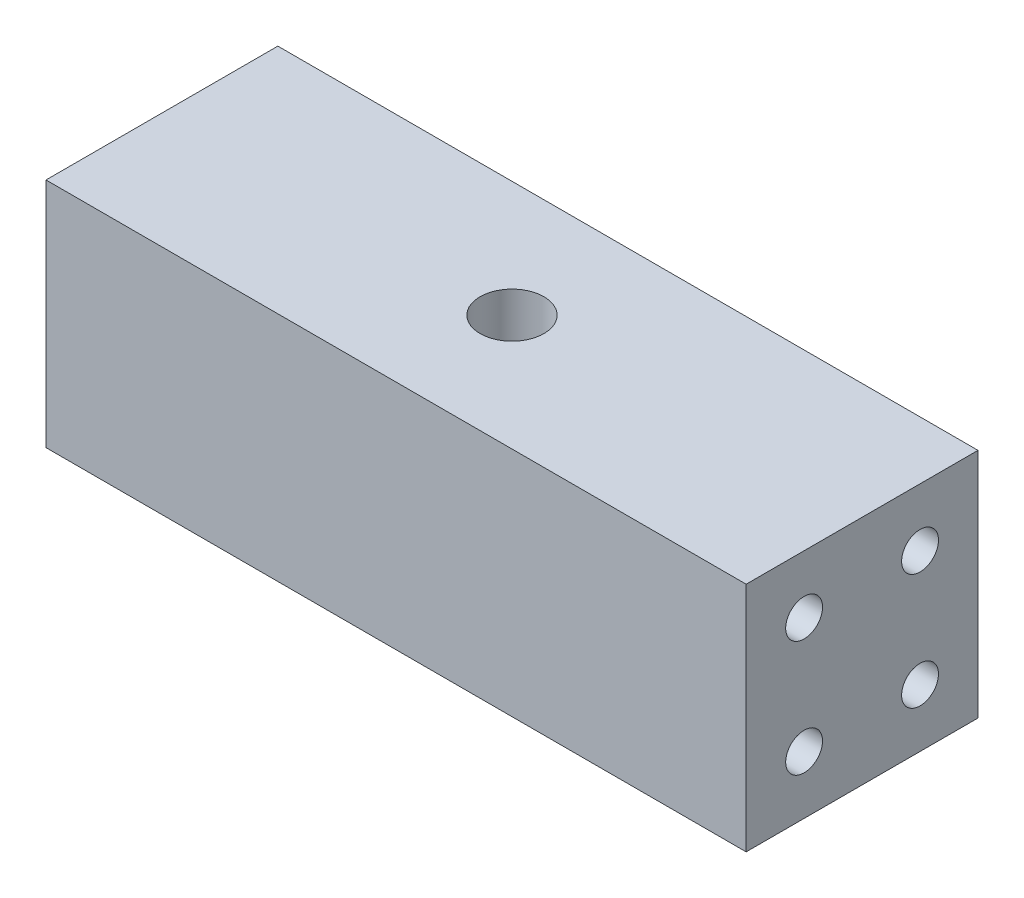
ISO-10303-21;
HEADER;
FILE_DESCRIPTION(('STEP AP214'),'2;1');
FILE_NAME('part.step','',(''),(''),'','','');
FILE_SCHEMA(('AUTOMOTIVE_DESIGN { 1 0 10303 214 1 1 1 1 }'));
ENDSEC;
DATA;
#1=APPLICATION_CONTEXT('core data for automotive mechanical design processes');
#2=APPLICATION_PROTOCOL_DEFINITION('international standard','automotive_design',2000,#1);
#3=PRODUCT_CONTEXT('',#1,'mechanical');
#4=PRODUCT('Part','Part','',(#3));
#5=PRODUCT_RELATED_PRODUCT_CATEGORY('part','',(#4));
#6=PRODUCT_DEFINITION_FORMATION('','',#4);
#7=PRODUCT_DEFINITION_CONTEXT('part definition',#1,'design');
#8=PRODUCT_DEFINITION('design','',#6,#7);
#9=PRODUCT_DEFINITION_SHAPE('','',#8);
#10=(LENGTH_UNIT() NAMED_UNIT(*) SI_UNIT(.MILLI.,.METRE.));
#11=(NAMED_UNIT(*) PLANE_ANGLE_UNIT() SI_UNIT($,.RADIAN.));
#12=(NAMED_UNIT(*) SI_UNIT($,.STERADIAN.) SOLID_ANGLE_UNIT());
#13=UNCERTAINTY_MEASURE_WITH_UNIT(LENGTH_MEASURE(1.E-05),#10,'distance_accuracy_value','');
#14=(GEOMETRIC_REPRESENTATION_CONTEXT(3) GLOBAL_UNCERTAINTY_ASSIGNED_CONTEXT((#13)) GLOBAL_UNIT_ASSIGNED_CONTEXT((#10,
#11,#12)) REPRESENTATION_CONTEXT('',''));
#15=CARTESIAN_POINT('',(0.,0.,0.));
#16=DIRECTION('',(0.,0.,1.));
#17=DIRECTION('',(1.,0.,0.));
#18=AXIS2_PLACEMENT_3D('',#15,#16,#17);
#19=CARTESIAN_POINT('',(0.,25.4,0.));
#20=DIRECTION('',(1.,0.,0.));
#21=DIRECTION('',(0.,0.,-1.));
#22=AXIS2_PLACEMENT_3D('',#19,#20,#21);
#23=PLANE('',#22);
#24=CARTESIAN_POINT('',(0.,19.05,-19.05));
#25=DIRECTION('',(-1.,0.,0.));
#26=DIRECTION('',(0.,0.,1.));
#27=AXIS2_PLACEMENT_3D('',#24,#25,#26);
#28=CIRCLE('',#27,2.0193);
#29=CARTESIAN_POINT('',(0.,19.05,-17.0307));
#30=VERTEX_POINT('',#29);
#31=EDGE_CURVE('E128',#30,#30,#28,.T.);
#32=ORIENTED_EDGE('',*,*,#31,.F.);
#33=EDGE_LOOP('',(#32));
#34=FACE_BOUND('',#33,.T.);
#35=CARTESIAN_POINT('',(0.,19.05,-6.35));
#36=DIRECTION('',(-1.,0.,0.));
#37=DIRECTION('',(0.,0.,1.));
#38=AXIS2_PLACEMENT_3D('',#35,#36,#37);
#39=CIRCLE('',#38,2.0193);
#40=CARTESIAN_POINT('',(0.,19.05,-4.3307));
#41=VERTEX_POINT('',#40);
#42=EDGE_CURVE('E127',#41,#41,#39,.T.);
#43=ORIENTED_EDGE('',*,*,#42,.F.);
#44=EDGE_LOOP('',(#43));
#45=FACE_BOUND('',#44,.T.);
#46=CARTESIAN_POINT('',(0.,6.35,-6.35));
#47=DIRECTION('',(-1.,0.,0.));
#48=DIRECTION('',(0.,0.,1.));
#49=AXIS2_PLACEMENT_3D('',#46,#47,#48);
#50=CIRCLE('',#49,2.0193);
#51=CARTESIAN_POINT('',(0.,6.35,-4.3307));
#52=VERTEX_POINT('',#51);
#53=EDGE_CURVE('E143',#52,#52,#50,.T.);
#54=ORIENTED_EDGE('',*,*,#53,.F.);
#55=EDGE_LOOP('',(#54));
#56=FACE_BOUND('',#55,.T.);
#57=CARTESIAN_POINT('',(0.,6.35,-19.05));
#58=DIRECTION('',(-1.,0.,0.));
#59=DIRECTION('',(0.,0.,1.));
#60=AXIS2_PLACEMENT_3D('',#57,#58,#59);
#61=CIRCLE('',#60,2.0193);
#62=CARTESIAN_POINT('',(0.,6.35,-17.0307));
#63=VERTEX_POINT('',#62);
#64=EDGE_CURVE('E151',#63,#63,#61,.T.);
#65=ORIENTED_EDGE('',*,*,#64,.F.);
#66=EDGE_LOOP('',(#65));
#67=FACE_BOUND('',#66,.T.);
#68=DIRECTION('',(0.,0.,1.));
#69=VECTOR('',#68,1.);
#70=CARTESIAN_POINT('',(0.,0.,0.));
#71=LINE('',#70,#69);
#72=CARTESIAN_POINT('',(0.,0.,-25.4));
#73=VERTEX_POINT('',#72);
#74=CARTESIAN_POINT('',(0.,0.,0.));
#75=VERTEX_POINT('',#74);
#76=EDGE_CURVE('E191',#73,#75,#71,.T.);
#77=ORIENTED_EDGE('',*,*,#76,.T.);
#78=DIRECTION('',(0.,-1.,0.));
#79=VECTOR('',#78,1.);
#80=CARTESIAN_POINT('',(0.,25.4,0.));
#81=LINE('',#80,#79);
#82=CARTESIAN_POINT('',(0.,25.4,0.));
#83=VERTEX_POINT('',#82);
#84=EDGE_CURVE('E11',#83,#75,#81,.T.);
#85=ORIENTED_EDGE('',*,*,#84,.F.);
#86=DIRECTION('',(0.,0.,1.));
#87=VECTOR('',#86,1.);
#88=CARTESIAN_POINT('',(0.,25.4,0.));
#89=LINE('',#88,#87);
#90=CARTESIAN_POINT('',(0.,25.4,-25.4));
#91=VERTEX_POINT('',#90);
#92=EDGE_CURVE('E192',#91,#83,#89,.T.);
#93=ORIENTED_EDGE('',*,*,#92,.F.);
#94=DIRECTION('',(0.,-1.,0.));
#95=VECTOR('',#94,1.);
#96=CARTESIAN_POINT('',(0.,25.4,-25.4));
#97=LINE('',#96,#95);
#98=EDGE_CURVE('E202',#91,#73,#97,.T.);
#99=ORIENTED_EDGE('',*,*,#98,.T.);
#100=EDGE_LOOP('',(#77,#85,#93,#99));
#101=FACE_BOUND('',#100,.T.);
#102=ADVANCED_FACE('F43',(#34,#45,#56,#67,#101),#23,.F.);
#103=CARTESIAN_POINT('',(0.,25.4,0.));
#104=DIRECTION('',(0.,0.,-1.));
#105=DIRECTION('',(-1.,0.,0.));
#106=AXIS2_PLACEMENT_3D('',#103,#104,#105);
#107=PLANE('',#106);
#108=DIRECTION('',(1.,0.,0.));
#109=VECTOR('',#108,1.);
#110=CARTESIAN_POINT('',(0.,0.,0.));
#111=LINE('',#110,#109);
#112=CARTESIAN_POINT('',(76.708,0.,0.));
#113=VERTEX_POINT('',#112);
#114=EDGE_CURVE('E206',#75,#113,#111,.T.);
#115=ORIENTED_EDGE('',*,*,#114,.T.);
#116=DIRECTION('',(0.,-1.,0.));
#117=VECTOR('',#116,1.);
#118=CARTESIAN_POINT('',(76.708,25.4,0.));
#119=LINE('',#118,#117);
#120=CARTESIAN_POINT('',(76.708,25.4,0.));
#121=VERTEX_POINT('',#120);
#122=EDGE_CURVE('E52',#121,#113,#119,.T.);
#123=ORIENTED_EDGE('',*,*,#122,.F.);
#124=DIRECTION('',(1.,0.,0.));
#125=VECTOR('',#124,1.);
#126=CARTESIAN_POINT('',(0.,25.4,0.));
#127=LINE('',#126,#125);
#128=EDGE_CURVE('E91',#83,#121,#127,.T.);
#129=ORIENTED_EDGE('',*,*,#128,.F.);
#130=ORIENTED_EDGE('',*,*,#84,.T.);
#131=EDGE_LOOP('',(#115,#123,#129,#130));
#132=FACE_BOUND('',#131,.T.);
#133=ADVANCED_FACE('F236',(#132),#107,.F.);
#134=CARTESIAN_POINT('',(76.708,25.4,0.));
#135=DIRECTION('',(-1.,0.,0.));
#136=DIRECTION('',(0.,0.,1.));
#137=AXIS2_PLACEMENT_3D('',#134,#135,#136);
#138=PLANE('',#137);
#139=CARTESIAN_POINT('',(76.708,19.05,-6.35));
#140=DIRECTION('',(1.,0.,0.));
#141=DIRECTION('',(0.,0.,-1.));
#142=AXIS2_PLACEMENT_3D('',#139,#140,#141);
#143=CIRCLE('',#142,2.0193);
#144=CARTESIAN_POINT('',(76.708,19.05,-8.3693));
#145=VERTEX_POINT('',#144);
#146=EDGE_CURVE('E159',#145,#145,#143,.T.);
#147=ORIENTED_EDGE('',*,*,#146,.F.);
#148=EDGE_LOOP('',(#147));
#149=FACE_BOUND('',#148,.T.);
#150=CARTESIAN_POINT('',(76.708,19.05,-19.05));
#151=DIRECTION('',(1.,0.,0.));
#152=DIRECTION('',(0.,0.,-1.));
#153=AXIS2_PLACEMENT_3D('',#150,#151,#152);
#154=CIRCLE('',#153,2.0193);
#155=CARTESIAN_POINT('',(76.708,19.05,-21.0693));
#156=VERTEX_POINT('',#155);
#157=EDGE_CURVE('E167',#156,#156,#154,.T.);
#158=ORIENTED_EDGE('',*,*,#157,.F.);
#159=EDGE_LOOP('',(#158));
#160=FACE_BOUND('',#159,.T.);
#161=CARTESIAN_POINT('',(76.708,6.35,-19.05));
#162=DIRECTION('',(1.,0.,0.));
#163=DIRECTION('',(0.,0.,-1.));
#164=AXIS2_PLACEMENT_3D('',#161,#162,#163);
#165=CIRCLE('',#164,2.0193);
#166=CARTESIAN_POINT('',(76.708,6.35,-21.0693));
#167=VERTEX_POINT('',#166);
#168=EDGE_CURVE('E175',#167,#167,#165,.T.);
#169=ORIENTED_EDGE('',*,*,#168,.F.);
#170=EDGE_LOOP('',(#169));
#171=FACE_BOUND('',#170,.T.);
#172=CARTESIAN_POINT('',(76.708,6.35,-6.35));
#173=DIRECTION('',(1.,0.,0.));
#174=DIRECTION('',(0.,0.,-1.));
#175=AXIS2_PLACEMENT_3D('',#172,#173,#174);
#176=CIRCLE('',#175,2.0193);
#177=CARTESIAN_POINT('',(76.708,6.35,-8.3693));
#178=VERTEX_POINT('',#177);
#179=EDGE_CURVE('E183',#178,#178,#176,.T.);
#180=ORIENTED_EDGE('',*,*,#179,.F.);
#181=EDGE_LOOP('',(#180));
#182=FACE_BOUND('',#181,.T.);
#183=DIRECTION('',(0.,0.,-1.));
#184=VECTOR('',#183,1.);
#185=CARTESIAN_POINT('',(76.708,0.,0.));
#186=LINE('',#185,#184);
#187=CARTESIAN_POINT('',(76.708,0.,-25.4));
#188=VERTEX_POINT('',#187);
#189=EDGE_CURVE('E78',#113,#188,#186,.T.);
#190=ORIENTED_EDGE('',*,*,#189,.T.);
#191=DIRECTION('',(0.,-1.,0.));
#192=VECTOR('',#191,1.);
#193=CARTESIAN_POINT('',(76.708,25.4,-25.4));
#194=LINE('',#193,#192);
#195=CARTESIAN_POINT('',(76.708,25.4,-25.4));
#196=VERTEX_POINT('',#195);
#197=EDGE_CURVE('E215',#196,#188,#194,.T.);
#198=ORIENTED_EDGE('',*,*,#197,.F.);
#199=DIRECTION('',(0.,0.,-1.));
#200=VECTOR('',#199,1.);
#201=CARTESIAN_POINT('',(76.708,25.4,0.));
#202=LINE('',#201,#200);
#203=EDGE_CURVE('E197',#121,#196,#202,.T.);
#204=ORIENTED_EDGE('',*,*,#203,.F.);
#205=ORIENTED_EDGE('',*,*,#122,.T.);
#206=EDGE_LOOP('',(#190,#198,#204,#205));
#207=FACE_BOUND('',#206,.T.);
#208=ADVANCED_FACE('F219',(#149,#160,#171,#182,#207),#138,.F.);
#209=CARTESIAN_POINT('',(0.,25.4,-25.4));
#210=DIRECTION('',(0.,0.,1.));
#211=DIRECTION('',(1.,0.,0.));
#212=AXIS2_PLACEMENT_3D('',#209,#210,#211);
#213=PLANE('',#212);
#214=DIRECTION('',(-1.,0.,0.));
#215=VECTOR('',#214,1.);
#216=CARTESIAN_POINT('',(0.,0.,-25.4));
#217=LINE('',#216,#215);
#218=EDGE_CURVE('E84',#188,#73,#217,.T.);
#219=ORIENTED_EDGE('',*,*,#218,.T.);
#220=ORIENTED_EDGE('',*,*,#98,.F.);
#221=DIRECTION('',(-1.,0.,0.));
#222=VECTOR('',#221,1.);
#223=CARTESIAN_POINT('',(0.,25.4,-25.4));
#224=LINE('',#223,#222);
#225=EDGE_CURVE('E60',#196,#91,#224,.T.);
#226=ORIENTED_EDGE('',*,*,#225,.F.);
#227=ORIENTED_EDGE('',*,*,#197,.T.);
#228=EDGE_LOOP('',(#219,#220,#226,#227));
#229=FACE_BOUND('',#228,.T.);
#230=ADVANCED_FACE('F226',(#229),#213,.F.);
#231=CARTESIAN_POINT('',(0.,25.4,0.));
#232=DIRECTION('',(0.,-1.,0.));
#233=DIRECTION('',(0.,0.,-1.));
#234=AXIS2_PLACEMENT_3D('',#231,#232,#233);
#235=PLANE('',#234);
#236=CARTESIAN_POINT('',(38.354,25.4,-12.7));
#237=DIRECTION('',(0.,1.,0.));
#238=DIRECTION('',(0.,0.,1.));
#239=AXIS2_PLACEMENT_3D('',#236,#237,#238);
#240=CIRCLE('',#239,3.49999999999999);
#241=CARTESIAN_POINT('',(38.354,25.4,-9.20000000000001));
#242=VERTEX_POINT('',#241);
#243=EDGE_CURVE('E310',#242,#242,#240,.T.);
#244=ORIENTED_EDGE('',*,*,#243,.F.);
#245=EDGE_LOOP('',(#244));
#246=FACE_BOUND('',#245,.T.);
#247=ORIENTED_EDGE('',*,*,#92,.T.);
#248=ORIENTED_EDGE('',*,*,#128,.T.);
#249=ORIENTED_EDGE('',*,*,#203,.T.);
#250=ORIENTED_EDGE('',*,*,#225,.T.);
#251=EDGE_LOOP('',(#247,#248,#249,#250));
#252=FACE_BOUND('',#251,.T.);
#253=ADVANCED_FACE('F228',(#246,#252),#235,.F.);
#254=CARTESIAN_POINT('',(0.,0.,0.));
#255=DIRECTION('',(0.,-1.,0.));
#256=DIRECTION('',(0.,0.,-1.));
#257=AXIS2_PLACEMENT_3D('',#254,#255,#256);
#258=PLANE('',#257);
#259=CARTESIAN_POINT('',(38.354,0.,-12.7));
#260=DIRECTION('',(0.,1.,0.));
#261=DIRECTION('',(0.,0.,1.));
#262=AXIS2_PLACEMENT_3D('',#259,#260,#261);
#263=CIRCLE('',#262,3.5);
#264=CARTESIAN_POINT('',(38.354,0.,-9.2));
#265=VERTEX_POINT('',#264);
#266=EDGE_CURVE('E136',#265,#265,#263,.T.);
#267=ORIENTED_EDGE('',*,*,#266,.T.);
#268=EDGE_LOOP('',(#267));
#269=FACE_BOUND('',#268,.T.);
#270=ORIENTED_EDGE('',*,*,#76,.F.);
#271=ORIENTED_EDGE('',*,*,#218,.F.);
#272=ORIENTED_EDGE('',*,*,#189,.F.);
#273=ORIENTED_EDGE('',*,*,#114,.F.);
#274=EDGE_LOOP('',(#270,#271,#272,#273));
#275=FACE_BOUND('',#274,.T.);
#276=ADVANCED_FACE('F222',(#269,#275),#258,.T.);
#277=CARTESIAN_POINT('',(68.072,6.35,-6.35));
#278=DIRECTION('',(1.,0.,0.));
#279=DIRECTION('',(0.,0.,-1.));
#280=AXIS2_PLACEMENT_3D('',#277,#278,#279);
#281=CONICAL_SURFACE('',#280,2.0193,1.02974425867665);
#282=CARTESIAN_POINT('',(66.8586821519976,6.35,-6.35));
#283=VERTEX_POINT('',#282);
#284=VERTEX_LOOP('',#283);
#285=FACE_BOUND('',#284,.T.);
#286=CARTESIAN_POINT('',(68.072,6.35,-6.35));
#287=DIRECTION('',(1.,0.,0.));
#288=DIRECTION('',(0.,0.,-1.));
#289=AXIS2_PLACEMENT_3D('',#286,#287,#288);
#290=CIRCLE('',#289,2.0193);
#291=CARTESIAN_POINT('',(68.072,6.35,-8.3693));
#292=VERTEX_POINT('',#291);
#293=EDGE_CURVE('E187',#292,#292,#290,.T.);
#294=ORIENTED_EDGE('',*,*,#293,.T.);
#295=EDGE_LOOP('',(#294));
#296=FACE_BOUND('',#295,.T.);
#297=ADVANCED_FACE('F298',(#285,#296),#281,.F.);
#298=CARTESIAN_POINT('',(76.708,6.35,-6.35));
#299=DIRECTION('',(1.,0.,0.));
#300=DIRECTION('',(0.,0.,-1.));
#301=AXIS2_PLACEMENT_3D('',#298,#299,#300);
#302=CYLINDRICAL_SURFACE('',#301,2.0193);
#303=ORIENTED_EDGE('',*,*,#293,.F.);
#304=EDGE_LOOP('',(#303));
#305=FACE_BOUND('',#304,.T.);
#306=ORIENTED_EDGE('',*,*,#179,.T.);
#307=EDGE_LOOP('',(#306));
#308=FACE_BOUND('',#307,.T.);
#309=ADVANCED_FACE('F294',(#305,#308),#302,.F.);
#310=CARTESIAN_POINT('',(68.072,6.35,-19.05));
#311=DIRECTION('',(1.,0.,0.));
#312=DIRECTION('',(0.,0.,-1.));
#313=AXIS2_PLACEMENT_3D('',#310,#311,#312);
#314=CONICAL_SURFACE('',#313,2.0193,1.02974425867665);
#315=CARTESIAN_POINT('',(66.8586821519976,6.35,-19.05));
#316=VERTEX_POINT('',#315);
#317=VERTEX_LOOP('',#316);
#318=FACE_BOUND('',#317,.T.);
#319=CARTESIAN_POINT('',(68.072,6.35,-19.05));
#320=DIRECTION('',(1.,0.,0.));
#321=DIRECTION('',(0.,0.,-1.));
#322=AXIS2_PLACEMENT_3D('',#319,#320,#321);
#323=CIRCLE('',#322,2.0193);
#324=CARTESIAN_POINT('',(68.072,6.35,-21.0693));
#325=VERTEX_POINT('',#324);
#326=EDGE_CURVE('E179',#325,#325,#323,.T.);
#327=ORIENTED_EDGE('',*,*,#326,.T.);
#328=EDGE_LOOP('',(#327));
#329=FACE_BOUND('',#328,.T.);
#330=ADVANCED_FACE('F290',(#318,#329),#314,.F.);
#331=CARTESIAN_POINT('',(76.708,6.35,-19.05));
#332=DIRECTION('',(1.,0.,0.));
#333=DIRECTION('',(0.,0.,-1.));
#334=AXIS2_PLACEMENT_3D('',#331,#332,#333);
#335=CYLINDRICAL_SURFACE('',#334,2.0193);
#336=ORIENTED_EDGE('',*,*,#326,.F.);
#337=EDGE_LOOP('',(#336));
#338=FACE_BOUND('',#337,.T.);
#339=ORIENTED_EDGE('',*,*,#168,.T.);
#340=EDGE_LOOP('',(#339));
#341=FACE_BOUND('',#340,.T.);
#342=ADVANCED_FACE('F286',(#338,#341),#335,.F.);
#343=CARTESIAN_POINT('',(68.072,19.05,-19.05));
#344=DIRECTION('',(1.,0.,0.));
#345=DIRECTION('',(0.,0.,-1.));
#346=AXIS2_PLACEMENT_3D('',#343,#344,#345);
#347=CONICAL_SURFACE('',#346,2.0193,1.02974425867665);
#348=CARTESIAN_POINT('',(66.8586821519976,19.05,-19.05));
#349=VERTEX_POINT('',#348);
#350=VERTEX_LOOP('',#349);
#351=FACE_BOUND('',#350,.T.);
#352=CARTESIAN_POINT('',(68.072,19.05,-19.05));
#353=DIRECTION('',(1.,0.,0.));
#354=DIRECTION('',(0.,0.,-1.));
#355=AXIS2_PLACEMENT_3D('',#352,#353,#354);
#356=CIRCLE('',#355,2.0193);
#357=CARTESIAN_POINT('',(68.072,19.05,-21.0693));
#358=VERTEX_POINT('',#357);
#359=EDGE_CURVE('E171',#358,#358,#356,.T.);
#360=ORIENTED_EDGE('',*,*,#359,.T.);
#361=EDGE_LOOP('',(#360));
#362=FACE_BOUND('',#361,.T.);
#363=ADVANCED_FACE('F282',(#351,#362),#347,.F.);
#364=CARTESIAN_POINT('',(76.708,19.05,-19.05));
#365=DIRECTION('',(1.,0.,0.));
#366=DIRECTION('',(0.,0.,-1.));
#367=AXIS2_PLACEMENT_3D('',#364,#365,#366);
#368=CYLINDRICAL_SURFACE('',#367,2.0193);
#369=ORIENTED_EDGE('',*,*,#359,.F.);
#370=EDGE_LOOP('',(#369));
#371=FACE_BOUND('',#370,.T.);
#372=ORIENTED_EDGE('',*,*,#157,.T.);
#373=EDGE_LOOP('',(#372));
#374=FACE_BOUND('',#373,.T.);
#375=ADVANCED_FACE('F278',(#371,#374),#368,.F.);
#376=CARTESIAN_POINT('',(68.072,19.05,-6.35));
#377=DIRECTION('',(1.,0.,0.));
#378=DIRECTION('',(0.,0.,-1.));
#379=AXIS2_PLACEMENT_3D('',#376,#377,#378);
#380=CONICAL_SURFACE('',#379,2.0193,1.02974425867665);
#381=CARTESIAN_POINT('',(66.8586821519976,19.05,-6.35));
#382=VERTEX_POINT('',#381);
#383=VERTEX_LOOP('',#382);
#384=FACE_BOUND('',#383,.T.);
#385=CARTESIAN_POINT('',(68.072,19.05,-6.35));
#386=DIRECTION('',(1.,0.,0.));
#387=DIRECTION('',(0.,0.,-1.));
#388=AXIS2_PLACEMENT_3D('',#385,#386,#387);
#389=CIRCLE('',#388,2.0193);
#390=CARTESIAN_POINT('',(68.072,19.05,-8.3693));
#391=VERTEX_POINT('',#390);
#392=EDGE_CURVE('E163',#391,#391,#389,.T.);
#393=ORIENTED_EDGE('',*,*,#392,.T.);
#394=EDGE_LOOP('',(#393));
#395=FACE_BOUND('',#394,.T.);
#396=ADVANCED_FACE('F274',(#384,#395),#380,.F.);
#397=CARTESIAN_POINT('',(76.708,19.05,-6.35));
#398=DIRECTION('',(1.,0.,0.));
#399=DIRECTION('',(0.,0.,-1.));
#400=AXIS2_PLACEMENT_3D('',#397,#398,#399);
#401=CYLINDRICAL_SURFACE('',#400,2.0193);
#402=ORIENTED_EDGE('',*,*,#392,.F.);
#403=EDGE_LOOP('',(#402));
#404=FACE_BOUND('',#403,.T.);
#405=ORIENTED_EDGE('',*,*,#146,.T.);
#406=EDGE_LOOP('',(#405));
#407=FACE_BOUND('',#406,.T.);
#408=ADVANCED_FACE('F266',(#404,#407),#401,.F.);
#409=CARTESIAN_POINT('',(8.636,6.35,-19.05));
#410=DIRECTION('',(-1.,0.,0.));
#411=DIRECTION('',(0.,0.,1.));
#412=AXIS2_PLACEMENT_3D('',#409,#410,#411);
#413=CONICAL_SURFACE('',#412,2.0193,1.02974425867665);
#414=CARTESIAN_POINT('',(9.84931784800235,6.35,-19.05));
#415=VERTEX_POINT('',#414);
#416=VERTEX_LOOP('',#415);
#417=FACE_BOUND('',#416,.T.);
#418=CARTESIAN_POINT('',(8.636,6.35,-19.05));
#419=DIRECTION('',(-1.,0.,0.));
#420=DIRECTION('',(0.,0.,1.));
#421=AXIS2_PLACEMENT_3D('',#418,#419,#420);
#422=CIRCLE('',#421,2.0193);
#423=CARTESIAN_POINT('',(8.636,6.35,-17.0307));
#424=VERTEX_POINT('',#423);
#425=EDGE_CURVE('E155',#424,#424,#422,.T.);
#426=ORIENTED_EDGE('',*,*,#425,.T.);
#427=EDGE_LOOP('',(#426));
#428=FACE_BOUND('',#427,.T.);
#429=ADVANCED_FACE('F256',(#417,#428),#413,.F.);
#430=CARTESIAN_POINT('',(0.,6.35,-19.05));
#431=DIRECTION('',(-1.,0.,0.));
#432=DIRECTION('',(0.,0.,1.));
#433=AXIS2_PLACEMENT_3D('',#430,#431,#432);
#434=CYLINDRICAL_SURFACE('',#433,2.0193);
#435=ORIENTED_EDGE('',*,*,#425,.F.);
#436=EDGE_LOOP('',(#435));
#437=FACE_BOUND('',#436,.T.);
#438=ORIENTED_EDGE('',*,*,#64,.T.);
#439=EDGE_LOOP('',(#438));
#440=FACE_BOUND('',#439,.T.);
#441=ADVANCED_FACE('F253',(#437,#440),#434,.F.);
#442=CARTESIAN_POINT('',(8.636,6.35,-6.35));
#443=DIRECTION('',(-1.,0.,0.));
#444=DIRECTION('',(0.,0.,1.));
#445=AXIS2_PLACEMENT_3D('',#442,#443,#444);
#446=CONICAL_SURFACE('',#445,2.0193,1.02974425867665);
#447=CARTESIAN_POINT('',(9.84931784800235,6.35,-6.35));
#448=VERTEX_POINT('',#447);
#449=VERTEX_LOOP('',#448);
#450=FACE_BOUND('',#449,.T.);
#451=CARTESIAN_POINT('',(8.636,6.35,-6.35));
#452=DIRECTION('',(-1.,0.,0.));
#453=DIRECTION('',(0.,0.,1.));
#454=AXIS2_PLACEMENT_3D('',#451,#452,#453);
#455=CIRCLE('',#454,2.0193);
#456=CARTESIAN_POINT('',(8.636,6.35,-4.3307));
#457=VERTEX_POINT('',#456);
#458=EDGE_CURVE('E147',#457,#457,#455,.T.);
#459=ORIENTED_EDGE('',*,*,#458,.T.);
#460=EDGE_LOOP('',(#459));
#461=FACE_BOUND('',#460,.T.);
#462=ADVANCED_FACE('F255',(#450,#461),#446,.F.);
#463=CARTESIAN_POINT('',(0.,6.35,-6.35));
#464=DIRECTION('',(-1.,0.,0.));
#465=DIRECTION('',(0.,0.,1.));
#466=AXIS2_PLACEMENT_3D('',#463,#464,#465);
#467=CYLINDRICAL_SURFACE('',#466,2.0193);
#468=ORIENTED_EDGE('',*,*,#458,.F.);
#469=EDGE_LOOP('',(#468));
#470=FACE_BOUND('',#469,.T.);
#471=ORIENTED_EDGE('',*,*,#53,.T.);
#472=EDGE_LOOP('',(#471));
#473=FACE_BOUND('',#472,.T.);
#474=ADVANCED_FACE('F263',(#470,#473),#467,.F.);
#475=CARTESIAN_POINT('',(8.636,19.05,-6.35));
#476=DIRECTION('',(-1.,0.,0.));
#477=DIRECTION('',(0.,0.,1.));
#478=AXIS2_PLACEMENT_3D('',#475,#476,#477);
#479=CONICAL_SURFACE('',#478,2.0193,1.02974425867665);
#480=CARTESIAN_POINT('',(9.84931784800235,19.05,-6.35));
#481=VERTEX_POINT('',#480);
#482=VERTEX_LOOP('',#481);
#483=FACE_BOUND('',#482,.T.);
#484=CARTESIAN_POINT('',(8.636,19.05,-6.35));
#485=DIRECTION('',(-1.,0.,0.));
#486=DIRECTION('',(0.,0.,1.));
#487=AXIS2_PLACEMENT_3D('',#484,#485,#486);
#488=CIRCLE('',#487,2.0193);
#489=CARTESIAN_POINT('',(8.636,19.05,-4.3307));
#490=VERTEX_POINT('',#489);
#491=EDGE_CURVE('E133',#490,#490,#488,.T.);
#492=ORIENTED_EDGE('',*,*,#491,.T.);
#493=EDGE_LOOP('',(#492));
#494=FACE_BOUND('',#493,.T.);
#495=ADVANCED_FACE('F326',(#483,#494),#479,.F.);
#496=CARTESIAN_POINT('',(0.,19.05,-6.35));
#497=DIRECTION('',(-1.,0.,0.));
#498=DIRECTION('',(0.,0.,1.));
#499=AXIS2_PLACEMENT_3D('',#496,#497,#498);
#500=CYLINDRICAL_SURFACE('',#499,2.0193);
#501=ORIENTED_EDGE('',*,*,#491,.F.);
#502=EDGE_LOOP('',(#501));
#503=FACE_BOUND('',#502,.T.);
#504=ORIENTED_EDGE('',*,*,#42,.T.);
#505=EDGE_LOOP('',(#504));
#506=FACE_BOUND('',#505,.T.);
#507=ADVANCED_FACE('F120',(#503,#506),#500,.F.);
#508=CARTESIAN_POINT('',(8.636,19.05,-19.05));
#509=DIRECTION('',(-1.,0.,0.));
#510=DIRECTION('',(0.,0.,1.));
#511=AXIS2_PLACEMENT_3D('',#508,#509,#510);
#512=CONICAL_SURFACE('',#511,2.0193,1.02974425867665);
#513=CARTESIAN_POINT('',(9.84931784800235,19.05,-19.05));
#514=VERTEX_POINT('',#513);
#515=VERTEX_LOOP('',#514);
#516=FACE_BOUND('',#515,.T.);
#517=CARTESIAN_POINT('',(8.636,19.05,-19.05));
#518=DIRECTION('',(-1.,0.,0.));
#519=DIRECTION('',(0.,0.,1.));
#520=AXIS2_PLACEMENT_3D('',#517,#518,#519);
#521=CIRCLE('',#520,2.0193);
#522=CARTESIAN_POINT('',(8.636,19.05,-17.0307));
#523=VERTEX_POINT('',#522);
#524=EDGE_CURVE('E124',#523,#523,#521,.T.);
#525=ORIENTED_EDGE('',*,*,#524,.T.);
#526=EDGE_LOOP('',(#525));
#527=FACE_BOUND('',#526,.T.);
#528=ADVANCED_FACE('F116',(#516,#527),#512,.F.);
#529=CARTESIAN_POINT('',(0.,19.05,-19.05));
#530=DIRECTION('',(-1.,0.,0.));
#531=DIRECTION('',(0.,0.,1.));
#532=AXIS2_PLACEMENT_3D('',#529,#530,#531);
#533=CYLINDRICAL_SURFACE('',#532,2.0193);
#534=ORIENTED_EDGE('',*,*,#524,.F.);
#535=EDGE_LOOP('',(#534));
#536=FACE_BOUND('',#535,.T.);
#537=ORIENTED_EDGE('',*,*,#31,.T.);
#538=EDGE_LOOP('',(#537));
#539=FACE_BOUND('',#538,.T.);
#540=ADVANCED_FACE('F119',(#536,#539),#533,.F.);
#541=CARTESIAN_POINT('',(38.354,25.4,-12.7));
#542=DIRECTION('',(0.,1.,0.));
#543=DIRECTION('',(0.,0.,1.));
#544=AXIS2_PLACEMENT_3D('',#541,#542,#543);
#545=CYLINDRICAL_SURFACE('',#544,3.49999999999999);
#546=ORIENTED_EDGE('',*,*,#266,.F.);
#547=EDGE_LOOP('',(#546));
#548=FACE_BOUND('',#547,.T.);
#549=ORIENTED_EDGE('',*,*,#243,.T.);
#550=EDGE_LOOP('',(#549));
#551=FACE_BOUND('',#550,.T.);
#552=ADVANCED_FACE('F316',(#548,#551),#545,.F.);
#553=CLOSED_SHELL('',(#102,#133,#208,#230,#253,#276,#297,#309,#330,#342,#363,#375,#396,#408,
#429,#441,#462,#474,#495,#507,#528,#540,#552));
#554=MANIFOLD_SOLID_BREP('B2',#553);
#555=ADVANCED_BREP_SHAPE_REPRESENTATION('',(#18,#554),#14);
#556=SHAPE_DEFINITION_REPRESENTATION(#9,#555);
ENDSEC;
END-ISO-10303-21;
